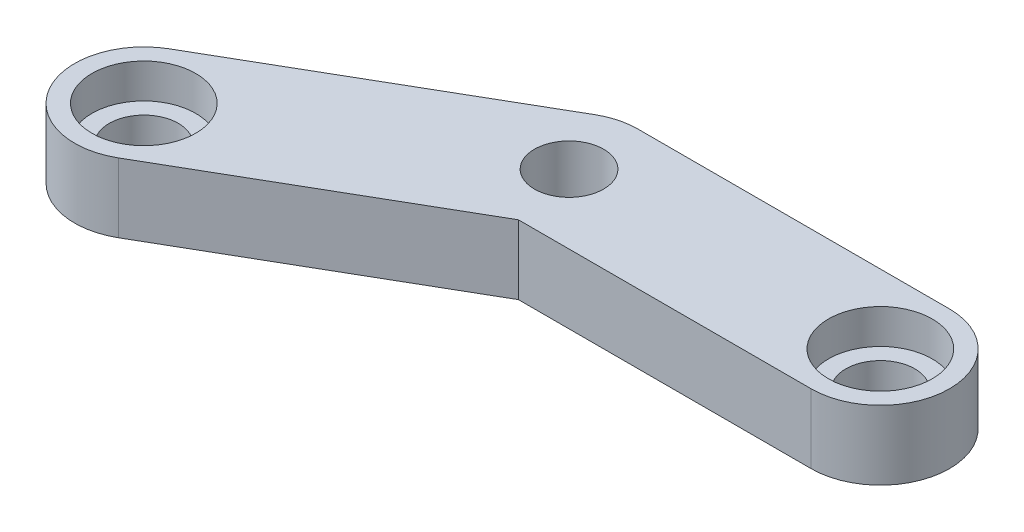
ISO-10303-21;
HEADER;
FILE_DESCRIPTION(('STEP AP214'),'2;1');
FILE_NAME('part.step','',(''),(''),'','','');
FILE_SCHEMA(('AUTOMOTIVE_DESIGN { 1 0 10303 214 1 1 1 1 }'));
ENDSEC;
DATA;
#1=APPLICATION_CONTEXT('core data for automotive mechanical design processes');
#2=APPLICATION_PROTOCOL_DEFINITION('international standard','automotive_design',2000,#1);
#3=PRODUCT_CONTEXT('',#1,'mechanical');
#4=PRODUCT('Part','Part','',(#3));
#5=PRODUCT_RELATED_PRODUCT_CATEGORY('part','',(#4));
#6=PRODUCT_DEFINITION_FORMATION('','',#4);
#7=PRODUCT_DEFINITION_CONTEXT('part definition',#1,'design');
#8=PRODUCT_DEFINITION('design','',#6,#7);
#9=PRODUCT_DEFINITION_SHAPE('','',#8);
#10=(LENGTH_UNIT() NAMED_UNIT(*) SI_UNIT(.MILLI.,.METRE.));
#11=(NAMED_UNIT(*) PLANE_ANGLE_UNIT() SI_UNIT($,.RADIAN.));
#12=(NAMED_UNIT(*) SI_UNIT($,.STERADIAN.) SOLID_ANGLE_UNIT());
#13=UNCERTAINTY_MEASURE_WITH_UNIT(LENGTH_MEASURE(1.E-05),#10,'distance_accuracy_value','');
#14=(GEOMETRIC_REPRESENTATION_CONTEXT(3) GLOBAL_UNCERTAINTY_ASSIGNED_CONTEXT((#13)) GLOBAL_UNIT_ASSIGNED_CONTEXT((#10,
#11,#12)) REPRESENTATION_CONTEXT('',''));
#15=CARTESIAN_POINT('',(0.,0.,0.));
#16=DIRECTION('',(0.,0.,1.));
#17=DIRECTION('',(1.,0.,0.));
#18=AXIS2_PLACEMENT_3D('',#15,#16,#17);
#19=CARTESIAN_POINT('',(22.5,5.,0.));
#20=DIRECTION('',(0.,-1.,0.));
#21=DIRECTION('',(0.,0.,-1.));
#22=AXIS2_PLACEMENT_3D('',#19,#20,#21);
#23=CYLINDRICAL_SURFACE('',#22,2.5);
#24=CARTESIAN_POINT('',(22.5,0.,0.));
#25=DIRECTION('',(0.,1.,0.));
#26=DIRECTION('',(0.,0.,1.));
#27=AXIS2_PLACEMENT_3D('',#24,#25,#26);
#28=CIRCLE('',#27,2.5);
#29=CARTESIAN_POINT('',(22.5,0.,2.5));
#30=VERTEX_POINT('',#29);
#31=EDGE_CURVE('E176',#30,#30,#28,.T.);
#32=ORIENTED_EDGE('',*,*,#31,.F.);
#33=EDGE_LOOP('',(#32));
#34=FACE_BOUND('',#33,.T.);
#35=CARTESIAN_POINT('',(22.5,2.5,0.));
#36=DIRECTION('',(0.,1.,0.));
#37=DIRECTION('',(0.,0.,1.));
#38=AXIS2_PLACEMENT_3D('',#35,#36,#37);
#39=CIRCLE('',#38,2.5);
#40=CARTESIAN_POINT('',(22.5,2.5,2.5));
#41=VERTEX_POINT('',#40);
#42=EDGE_CURVE('E39',#41,#41,#39,.T.);
#43=ORIENTED_EDGE('',*,*,#42,.T.);
#44=EDGE_LOOP('',(#43));
#45=FACE_BOUND('',#44,.T.);
#46=ADVANCED_FACE('F35',(#34,#45),#23,.F.);
#47=CARTESIAN_POINT('',(-19.4855715851499,0.,11.2499999999999));
#48=DIRECTION('',(0.,1.,0.));
#49=DIRECTION('',(0.,0.,1.));
#50=AXIS2_PLACEMENT_3D('',#47,#48,#49);
#51=CYLINDRICAL_SURFACE('',#50,2.5);
#52=CARTESIAN_POINT('',(-19.4855715851499,0.,11.2499999999999));
#53=DIRECTION('',(0.,1.,0.));
#54=DIRECTION('',(0.,0.,1.));
#55=AXIS2_PLACEMENT_3D('',#52,#53,#54);
#56=CIRCLE('',#55,2.5);
#57=CARTESIAN_POINT('',(-19.4855715851499,0.,13.7499999999999));
#58=VERTEX_POINT('',#57);
#59=EDGE_CURVE('E114',#58,#58,#56,.T.);
#60=ORIENTED_EDGE('',*,*,#59,.F.);
#61=EDGE_LOOP('',(#60));
#62=FACE_BOUND('',#61,.T.);
#63=CARTESIAN_POINT('',(-19.4855715851499,2.5,11.2499999999999));
#64=DIRECTION('',(0.,1.,0.));
#65=DIRECTION('',(0.,0.,1.));
#66=AXIS2_PLACEMENT_3D('',#63,#64,#65);
#67=CIRCLE('',#66,2.5);
#68=CARTESIAN_POINT('',(-19.4855715851499,2.5,13.7499999999999));
#69=VERTEX_POINT('',#68);
#70=EDGE_CURVE('E145',#69,#69,#67,.F.);
#71=ORIENTED_EDGE('',*,*,#70,.F.);
#72=EDGE_LOOP('',(#71));
#73=FACE_BOUND('',#72,.T.);
#74=ADVANCED_FACE('F208',(#62,#73),#51,.F.);
#75=CARTESIAN_POINT('',(0.,5.,0.));
#76=DIRECTION('',(0.,-1.,0.));
#77=DIRECTION('',(0.,0.,-1.));
#78=AXIS2_PLACEMENT_3D('',#75,#76,#77);
#79=CYLINDRICAL_SURFACE('',#78,5.);
#80=DIRECTION('',(0.,1.,0.));
#81=VECTOR('',#80,1.);
#82=CARTESIAN_POINT('',(-2.49999999999998,0.,-4.33012701892221));
#83=LINE('',#82,#81);
#84=CARTESIAN_POINT('',(-2.49999999999998,0.,-4.33012701892221));
#85=VERTEX_POINT('',#84);
#86=CARTESIAN_POINT('',(-2.49999999999998,5.,-4.33012701892221));
#87=VERTEX_POINT('',#86);
#88=EDGE_CURVE('E103',#85,#87,#83,.T.);
#89=ORIENTED_EDGE('',*,*,#88,.T.);
#90=CARTESIAN_POINT('',(0.,5.,0.));
#91=DIRECTION('',(0.,1.,0.));
#92=DIRECTION('',(0.,0.,1.));
#93=AXIS2_PLACEMENT_3D('',#90,#91,#92);
#94=CIRCLE('',#93,5.);
#95=CARTESIAN_POINT('',(0.,5.,-5.));
#96=VERTEX_POINT('',#95);
#97=EDGE_CURVE('E140',#96,#87,#94,.T.);
#98=ORIENTED_EDGE('',*,*,#97,.F.);
#99=DIRECTION('',(0.,-1.,0.));
#100=VECTOR('',#99,1.);
#101=CARTESIAN_POINT('',(0.,5.,-5.));
#102=LINE('',#101,#100);
#103=CARTESIAN_POINT('',(0.,0.,-5.));
#104=VERTEX_POINT('',#103);
#105=EDGE_CURVE('E126',#96,#104,#102,.T.);
#106=ORIENTED_EDGE('',*,*,#105,.T.);
#107=CARTESIAN_POINT('',(0.,0.,0.));
#108=DIRECTION('',(0.,1.,0.));
#109=DIRECTION('',(0.,0.,1.));
#110=AXIS2_PLACEMENT_3D('',#107,#108,#109);
#111=CIRCLE('',#110,5.);
#112=EDGE_CURVE('E121',#104,#85,#111,.T.);
#113=ORIENTED_EDGE('',*,*,#112,.T.);
#114=EDGE_LOOP('',(#89,#98,#106,#113));
#115=FACE_BOUND('',#114,.T.);
#116=ADVANCED_FACE('F37',(#115),#79,.T.);
#117=CARTESIAN_POINT('',(0.,5.,5.));
#118=DIRECTION('',(0.,0.,-1.));
#119=DIRECTION('',(-1.,0.,0.));
#120=AXIS2_PLACEMENT_3D('',#117,#118,#119);
#121=PLANE('',#120);
#122=DIRECTION('',(0.,1.,0.));
#123=VECTOR('',#122,1.);
#124=CARTESIAN_POINT('',(1.3397459621556,5.,5.));
#125=LINE('',#124,#123);
#126=CARTESIAN_POINT('',(1.3397459621556,0.,5.));
#127=VERTEX_POINT('',#126);
#128=CARTESIAN_POINT('',(1.3397459621556,5.,5.));
#129=VERTEX_POINT('',#128);
#130=EDGE_CURVE('E11',#127,#129,#125,.T.);
#131=ORIENTED_EDGE('',*,*,#130,.F.);
#132=DIRECTION('',(1.,0.,0.));
#133=VECTOR('',#132,1.);
#134=CARTESIAN_POINT('',(0.,0.,5.));
#135=LINE('',#134,#133);
#136=CARTESIAN_POINT('',(22.5,0.,5.));
#137=VERTEX_POINT('',#136);
#138=EDGE_CURVE('E127',#127,#137,#135,.T.);
#139=ORIENTED_EDGE('',*,*,#138,.T.);
#140=DIRECTION('',(0.,-1.,0.));
#141=VECTOR('',#140,1.);
#142=CARTESIAN_POINT('',(22.5,5.,5.));
#143=LINE('',#142,#141);
#144=CARTESIAN_POINT('',(22.5,5.,5.));
#145=VERTEX_POINT('',#144);
#146=EDGE_CURVE('E44',#145,#137,#143,.T.);
#147=ORIENTED_EDGE('',*,*,#146,.F.);
#148=DIRECTION('',(1.,0.,0.));
#149=VECTOR('',#148,1.);
#150=CARTESIAN_POINT('',(0.,5.,5.));
#151=LINE('',#150,#149);
#152=EDGE_CURVE('E79',#129,#145,#151,.T.);
#153=ORIENTED_EDGE('',*,*,#152,.F.);
#154=EDGE_LOOP('',(#131,#139,#147,#153));
#155=FACE_BOUND('',#154,.T.);
#156=ADVANCED_FACE('F200',(#155),#121,.F.);
#157=CARTESIAN_POINT('',(0.,5.,0.));
#158=DIRECTION('',(0.,1.,0.));
#159=DIRECTION('',(0.,0.,1.));
#160=AXIS2_PLACEMENT_3D('',#157,#158,#159);
#161=PLANE('',#160);
#162=CARTESIAN_POINT('',(22.5,5.,0.));
#163=DIRECTION('',(0.,1.,0.));
#164=DIRECTION('',(0.,0.,1.));
#165=AXIS2_PLACEMENT_3D('',#162,#163,#164);
#166=CIRCLE('',#165,3.75);
#167=CARTESIAN_POINT('',(22.5,5.,3.75));
#168=VERTEX_POINT('',#167);
#169=EDGE_CURVE('E152',#168,#168,#166,.T.);
#170=ORIENTED_EDGE('',*,*,#169,.F.);
#171=EDGE_LOOP('',(#170));
#172=FACE_BOUND('',#171,.T.);
#173=CARTESIAN_POINT('',(-19.4855715851499,5.,11.2499999999999));
#174=DIRECTION('',(0.,1.,0.));
#175=DIRECTION('',(0.,0.,1.));
#176=AXIS2_PLACEMENT_3D('',#173,#174,#175);
#177=CIRCLE('',#176,3.75);
#178=CARTESIAN_POINT('',(-19.4855715851499,5.,14.9999999999999));
#179=VERTEX_POINT('',#178);
#180=EDGE_CURVE('E162',#179,#179,#177,.T.);
#181=ORIENTED_EDGE('',*,*,#180,.F.);
#182=EDGE_LOOP('',(#181));
#183=FACE_BOUND('',#182,.T.);
#184=DIRECTION('',(-0.866025403784442,0.,0.499999999999995));
#185=VECTOR('',#184,1.);
#186=CARTESIAN_POINT('',(2.49999999999998,5.,4.33012701892221));
#187=LINE('',#186,#185);
#188=CARTESIAN_POINT('',(-16.98557158515,5.,15.5801270189221));
#189=VERTEX_POINT('',#188);
#190=EDGE_CURVE('E52',#129,#189,#187,.T.);
#191=ORIENTED_EDGE('',*,*,#190,.F.);
#192=ORIENTED_EDGE('',*,*,#152,.T.);
#193=CARTESIAN_POINT('',(22.5,5.,0.));
#194=DIRECTION('',(0.,1.,0.));
#195=DIRECTION('',(0.,0.,1.));
#196=AXIS2_PLACEMENT_3D('',#193,#194,#195);
#197=CIRCLE('',#196,5.);
#198=CARTESIAN_POINT('',(22.5,5.,-5.));
#199=VERTEX_POINT('',#198);
#200=EDGE_CURVE('E183',#145,#199,#197,.T.);
#201=ORIENTED_EDGE('',*,*,#200,.T.);
#202=DIRECTION('',(-1.,0.,0.));
#203=VECTOR('',#202,1.);
#204=CARTESIAN_POINT('',(0.,5.,-5.));
#205=LINE('',#204,#203);
#206=EDGE_CURVE('E59',#199,#96,#205,.T.);
#207=ORIENTED_EDGE('',*,*,#206,.T.);
#208=ORIENTED_EDGE('',*,*,#97,.T.);
#209=DIRECTION('',(-0.866025403784442,0.,0.499999999999995));
#210=VECTOR('',#209,1.);
#211=CARTESIAN_POINT('',(-2.49999999999997,5.,-4.33012701892221));
#212=LINE('',#211,#210);
#213=CARTESIAN_POINT('',(-21.9855715851499,5.,6.91987298107768));
#214=VERTEX_POINT('',#213);
#215=EDGE_CURVE('E109',#87,#214,#212,.T.);
#216=ORIENTED_EDGE('',*,*,#215,.T.);
#217=CARTESIAN_POINT('',(-19.4855715851499,5.,11.2499999999999));
#218=DIRECTION('',(0.,1.,0.));
#219=DIRECTION('',(0.,0.,1.));
#220=AXIS2_PLACEMENT_3D('',#217,#218,#219);
#221=CIRCLE('',#220,5.);
#222=EDGE_CURVE('E165',#214,#189,#221,.T.);
#223=ORIENTED_EDGE('',*,*,#222,.T.);
#224=EDGE_LOOP('',(#191,#192,#201,#207,#208,#216,#223));
#225=FACE_BOUND('',#224,.T.);
#226=CARTESIAN_POINT('',(0.,5.,0.));
#227=DIRECTION('',(0.,1.,0.));
#228=DIRECTION('',(0.,0.,1.));
#229=AXIS2_PLACEMENT_3D('',#226,#227,#228);
#230=CIRCLE('',#229,2.5);
#231=CARTESIAN_POINT('',(0.,5.,2.5));
#232=VERTEX_POINT('',#231);
#233=EDGE_CURVE('E128',#232,#232,#230,.T.);
#234=ORIENTED_EDGE('',*,*,#233,.F.);
#235=EDGE_LOOP('',(#234));
#236=FACE_BOUND('',#235,.T.);
#237=ADVANCED_FACE('F186',(#172,#183,#225,#236),#161,.T.);
#238=CARTESIAN_POINT('',(0.,0.,0.));
#239=DIRECTION('',(0.,1.,0.));
#240=DIRECTION('',(0.,0.,1.));
#241=AXIS2_PLACEMENT_3D('',#238,#239,#240);
#242=PLANE('',#241);
#243=ORIENTED_EDGE('',*,*,#138,.F.);
#244=DIRECTION('',(-0.866025403784442,0.,0.499999999999995));
#245=VECTOR('',#244,1.);
#246=CARTESIAN_POINT('',(2.49999999999998,0.,4.33012701892221));
#247=LINE('',#246,#245);
#248=CARTESIAN_POINT('',(-16.98557158515,0.,15.5801270189221));
#249=VERTEX_POINT('',#248);
#250=EDGE_CURVE('E124',#127,#249,#247,.T.);
#251=ORIENTED_EDGE('',*,*,#250,.T.);
#252=CARTESIAN_POINT('',(-19.4855715851499,0.,11.2499999999999));
#253=DIRECTION('',(0.,1.,0.));
#254=DIRECTION('',(0.,0.,1.));
#255=AXIS2_PLACEMENT_3D('',#252,#253,#254);
#256=CIRCLE('',#255,5.);
#257=CARTESIAN_POINT('',(-21.9855715851499,0.,6.91987298107768));
#258=VERTEX_POINT('',#257);
#259=EDGE_CURVE('E123',#258,#249,#256,.T.);
#260=ORIENTED_EDGE('',*,*,#259,.F.);
#261=DIRECTION('',(-0.866025403784442,0.,0.499999999999995));
#262=VECTOR('',#261,1.);
#263=CARTESIAN_POINT('',(-2.49999999999997,0.,-4.33012701892221));
#264=LINE('',#263,#262);
#265=EDGE_CURVE('E106',#85,#258,#264,.T.);
#266=ORIENTED_EDGE('',*,*,#265,.F.);
#267=ORIENTED_EDGE('',*,*,#112,.F.);
#268=DIRECTION('',(-1.,0.,0.));
#269=VECTOR('',#268,1.);
#270=CARTESIAN_POINT('',(0.,0.,-5.));
#271=LINE('',#270,#269);
#272=CARTESIAN_POINT('',(22.5,0.,-5.));
#273=VERTEX_POINT('',#272);
#274=EDGE_CURVE('E76',#273,#104,#271,.T.);
#275=ORIENTED_EDGE('',*,*,#274,.F.);
#276=CARTESIAN_POINT('',(22.5,0.,0.));
#277=DIRECTION('',(0.,1.,0.));
#278=DIRECTION('',(0.,0.,1.));
#279=AXIS2_PLACEMENT_3D('',#276,#277,#278);
#280=CIRCLE('',#279,5.);
#281=EDGE_CURVE('E130',#137,#273,#280,.T.);
#282=ORIENTED_EDGE('',*,*,#281,.F.);
#283=EDGE_LOOP('',(#243,#251,#260,#266,#267,#275,#282));
#284=FACE_BOUND('',#283,.T.);
#285=CARTESIAN_POINT('',(0.,0.,0.));
#286=DIRECTION('',(0.,1.,0.));
#287=DIRECTION('',(0.,0.,1.));
#288=AXIS2_PLACEMENT_3D('',#285,#286,#287);
#289=CIRCLE('',#288,2.5);
#290=CARTESIAN_POINT('',(0.,0.,2.5));
#291=VERTEX_POINT('',#290);
#292=EDGE_CURVE('E133',#291,#291,#289,.T.);
#293=ORIENTED_EDGE('',*,*,#292,.T.);
#294=EDGE_LOOP('',(#293));
#295=FACE_BOUND('',#294,.T.);
#296=ORIENTED_EDGE('',*,*,#59,.T.);
#297=EDGE_LOOP('',(#296));
#298=FACE_BOUND('',#297,.T.);
#299=ORIENTED_EDGE('',*,*,#31,.T.);
#300=EDGE_LOOP('',(#299));
#301=FACE_BOUND('',#300,.T.);
#302=ADVANCED_FACE('F119',(#284,#295,#298,#301),#242,.F.);
#303=CARTESIAN_POINT('',(22.5,5.,0.));
#304=DIRECTION('',(0.,-1.,0.));
#305=DIRECTION('',(0.,0.,-1.));
#306=AXIS2_PLACEMENT_3D('',#303,#304,#305);
#307=CYLINDRICAL_SURFACE('',#306,5.);
#308=ORIENTED_EDGE('',*,*,#281,.T.);
#309=DIRECTION('',(0.,-1.,0.));
#310=VECTOR('',#309,1.);
#311=CARTESIAN_POINT('',(22.5,5.,-5.));
#312=LINE('',#311,#310);
#313=EDGE_CURVE('E142',#199,#273,#312,.T.);
#314=ORIENTED_EDGE('',*,*,#313,.F.);
#315=ORIENTED_EDGE('',*,*,#200,.F.);
#316=ORIENTED_EDGE('',*,*,#146,.T.);
#317=EDGE_LOOP('',(#308,#314,#315,#316));
#318=FACE_BOUND('',#317,.T.);
#319=ADVANCED_FACE('F189',(#318),#307,.T.);
#320=CARTESIAN_POINT('',(0.,5.,-5.));
#321=DIRECTION('',(0.,0.,1.));
#322=DIRECTION('',(1.,0.,0.));
#323=AXIS2_PLACEMENT_3D('',#320,#321,#322);
#324=PLANE('',#323);
#325=ORIENTED_EDGE('',*,*,#274,.T.);
#326=ORIENTED_EDGE('',*,*,#105,.F.);
#327=ORIENTED_EDGE('',*,*,#206,.F.);
#328=ORIENTED_EDGE('',*,*,#313,.T.);
#329=EDGE_LOOP('',(#325,#326,#327,#328));
#330=FACE_BOUND('',#329,.T.);
#331=ADVANCED_FACE('F191',(#330),#324,.F.);
#332=CARTESIAN_POINT('',(0.,5.,0.));
#333=DIRECTION('',(0.,-1.,0.));
#334=DIRECTION('',(0.,0.,-1.));
#335=AXIS2_PLACEMENT_3D('',#332,#333,#334);
#336=CYLINDRICAL_SURFACE('',#335,2.5);
#337=ORIENTED_EDGE('',*,*,#233,.T.);
#338=EDGE_LOOP('',(#337));
#339=FACE_BOUND('',#338,.T.);
#340=ORIENTED_EDGE('',*,*,#292,.F.);
#341=EDGE_LOOP('',(#340));
#342=FACE_BOUND('',#341,.T.);
#343=ADVANCED_FACE('F223',(#339,#342),#336,.F.);
#344=CARTESIAN_POINT('',(2.49999999999998,0.,4.33012701892221));
#345=DIRECTION('',(-0.499999999999995,0.,-0.866025403784442));
#346=DIRECTION('',(-0.866025403784442,0.,0.499999999999995));
#347=AXIS2_PLACEMENT_3D('',#344,#345,#346);
#348=PLANE('',#347);
#349=ORIENTED_EDGE('',*,*,#250,.F.);
#350=ORIENTED_EDGE('',*,*,#130,.T.);
#351=ORIENTED_EDGE('',*,*,#190,.T.);
#352=DIRECTION('',(0.,1.,0.));
#353=VECTOR('',#352,1.);
#354=CARTESIAN_POINT('',(-16.98557158515,0.,15.5801270189221));
#355=LINE('',#354,#353);
#356=EDGE_CURVE('E173',#249,#189,#355,.T.);
#357=ORIENTED_EDGE('',*,*,#356,.F.);
#358=EDGE_LOOP('',(#349,#350,#351,#357));
#359=FACE_BOUND('',#358,.T.);
#360=ADVANCED_FACE('F197',(#359),#348,.F.);
#361=CARTESIAN_POINT('',(-19.4855715851499,0.,11.2499999999999));
#362=DIRECTION('',(0.,1.,0.));
#363=DIRECTION('',(0.,0.,1.));
#364=AXIS2_PLACEMENT_3D('',#361,#362,#363);
#365=CYLINDRICAL_SURFACE('',#364,5.);
#366=ORIENTED_EDGE('',*,*,#222,.F.);
#367=DIRECTION('',(0.,1.,0.));
#368=VECTOR('',#367,1.);
#369=CARTESIAN_POINT('',(-21.9855715851499,0.,6.91987298107768));
#370=LINE('',#369,#368);
#371=EDGE_CURVE('E113',#258,#214,#370,.T.);
#372=ORIENTED_EDGE('',*,*,#371,.F.);
#373=ORIENTED_EDGE('',*,*,#259,.T.);
#374=ORIENTED_EDGE('',*,*,#356,.T.);
#375=EDGE_LOOP('',(#366,#372,#373,#374));
#376=FACE_BOUND('',#375,.T.);
#377=ADVANCED_FACE('F194',(#376),#365,.T.);
#378=CARTESIAN_POINT('',(-2.49999999999997,0.,-4.33012701892221));
#379=DIRECTION('',(-0.499999999999995,0.,-0.866025403784442));
#380=DIRECTION('',(-0.866025403784442,0.,0.499999999999995));
#381=AXIS2_PLACEMENT_3D('',#378,#379,#380);
#382=PLANE('',#381);
#383=ORIENTED_EDGE('',*,*,#215,.F.);
#384=ORIENTED_EDGE('',*,*,#88,.F.);
#385=ORIENTED_EDGE('',*,*,#265,.T.);
#386=ORIENTED_EDGE('',*,*,#371,.T.);
#387=EDGE_LOOP('',(#383,#384,#385,#386));
#388=FACE_BOUND('',#387,.T.);
#389=ADVANCED_FACE('F105',(#388),#382,.T.);
#390=CARTESIAN_POINT('',(-19.4855715851499,2.5,11.2499999999999));
#391=DIRECTION('',(0.,1.,0.));
#392=DIRECTION('',(0.,0.,1.));
#393=AXIS2_PLACEMENT_3D('',#390,#391,#392);
#394=PLANE('',#393);
#395=CARTESIAN_POINT('',(-19.4855715851499,2.5,11.2499999999999));
#396=DIRECTION('',(0.,1.,0.));
#397=DIRECTION('',(0.,0.,1.));
#398=AXIS2_PLACEMENT_3D('',#395,#396,#397);
#399=CIRCLE('',#398,3.75);
#400=CARTESIAN_POINT('',(-19.4855715851499,2.5,14.9999999999999));
#401=VERTEX_POINT('',#400);
#402=EDGE_CURVE('E157',#401,#401,#399,.T.);
#403=ORIENTED_EDGE('',*,*,#402,.T.);
#404=EDGE_LOOP('',(#403));
#405=FACE_BOUND('',#404,.T.);
#406=ORIENTED_EDGE('',*,*,#70,.T.);
#407=EDGE_LOOP('',(#406));
#408=FACE_BOUND('',#407,.T.);
#409=ADVANCED_FACE('F261',(#405,#408),#394,.T.);
#410=CARTESIAN_POINT('',(-19.4855715851499,2.5,11.2499999999999));
#411=DIRECTION('',(0.,1.,0.));
#412=DIRECTION('',(0.,0.,1.));
#413=AXIS2_PLACEMENT_3D('',#410,#411,#412);
#414=CYLINDRICAL_SURFACE('',#413,3.75);
#415=ORIENTED_EDGE('',*,*,#402,.F.);
#416=EDGE_LOOP('',(#415));
#417=FACE_BOUND('',#416,.T.);
#418=ORIENTED_EDGE('',*,*,#180,.T.);
#419=EDGE_LOOP('',(#418));
#420=FACE_BOUND('',#419,.T.);
#421=ADVANCED_FACE('F267',(#417,#420),#414,.F.);
#422=CARTESIAN_POINT('',(22.5,2.5,0.));
#423=DIRECTION('',(0.,1.,0.));
#424=DIRECTION('',(0.,0.,1.));
#425=AXIS2_PLACEMENT_3D('',#422,#423,#424);
#426=CYLINDRICAL_SURFACE('',#425,3.75);
#427=CARTESIAN_POINT('',(22.5,2.5,0.));
#428=DIRECTION('',(0.,1.,0.));
#429=DIRECTION('',(0.,0.,1.));
#430=AXIS2_PLACEMENT_3D('',#427,#428,#429);
#431=CIRCLE('',#430,3.75);
#432=CARTESIAN_POINT('',(22.5,2.5,3.75));
#433=VERTEX_POINT('',#432);
#434=EDGE_CURVE('E147',#433,#433,#431,.T.);
#435=ORIENTED_EDGE('',*,*,#434,.F.);
#436=EDGE_LOOP('',(#435));
#437=FACE_BOUND('',#436,.T.);
#438=ORIENTED_EDGE('',*,*,#169,.T.);
#439=EDGE_LOOP('',(#438));
#440=FACE_BOUND('',#439,.T.);
#441=ADVANCED_FACE('F276',(#437,#440),#426,.F.);
#442=CARTESIAN_POINT('',(22.5,2.5,0.));
#443=DIRECTION('',(0.,1.,0.));
#444=DIRECTION('',(0.,0.,1.));
#445=AXIS2_PLACEMENT_3D('',#442,#443,#444);
#446=PLANE('',#445);
#447=ORIENTED_EDGE('',*,*,#42,.F.);
#448=EDGE_LOOP('',(#447));
#449=FACE_BOUND('',#448,.T.);
#450=ORIENTED_EDGE('',*,*,#434,.T.);
#451=EDGE_LOOP('',(#450));
#452=FACE_BOUND('',#451,.T.);
#453=ADVANCED_FACE('F284',(#449,#452),#446,.T.);
#454=CLOSED_SHELL('',(#46,#74,#116,#156,#237,#302,#319,#331,#343,#360,#377,#389,#409,#421,#441,#453));
#455=MANIFOLD_SOLID_BREP('B2',#454);
#456=ADVANCED_BREP_SHAPE_REPRESENTATION('',(#18,#455),#14);
#457=SHAPE_DEFINITION_REPRESENTATION(#9,#456);
ENDSEC;
END-ISO-10303-21;
